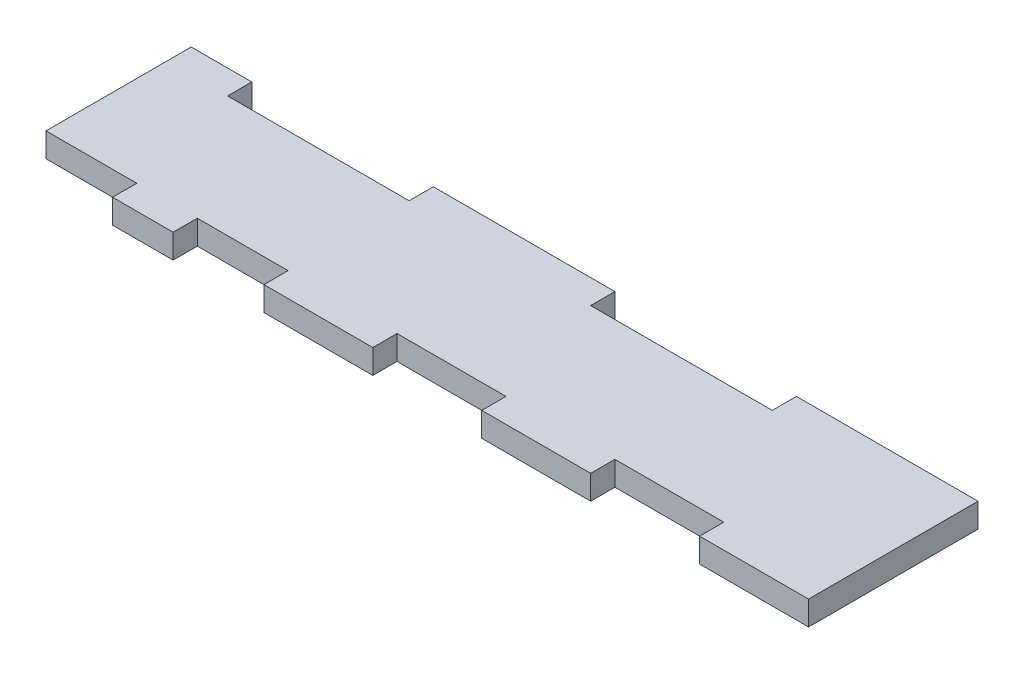
ISO-10303-21;
HEADER;
FILE_DESCRIPTION(('STEP AP214'),'2;1');
FILE_NAME('part.step','',(''),(''),'','','');
FILE_SCHEMA(('AUTOMOTIVE_DESIGN { 1 0 10303 214 1 1 1 1 }'));
ENDSEC;
DATA;
#1=APPLICATION_CONTEXT('core data for automotive mechanical design processes');
#2=APPLICATION_PROTOCOL_DEFINITION('international standard','automotive_design',2000,#1);
#3=PRODUCT_CONTEXT('',#1,'mechanical');
#4=PRODUCT('Part','Part','',(#3));
#5=PRODUCT_RELATED_PRODUCT_CATEGORY('part','',(#4));
#6=PRODUCT_DEFINITION_FORMATION('','',#4);
#7=PRODUCT_DEFINITION_CONTEXT('part definition',#1,'design');
#8=PRODUCT_DEFINITION('design','',#6,#7);
#9=PRODUCT_DEFINITION_SHAPE('','',#8);
#10=(LENGTH_UNIT() NAMED_UNIT(*) SI_UNIT(.MILLI.,.METRE.));
#11=(NAMED_UNIT(*) PLANE_ANGLE_UNIT() SI_UNIT($,.RADIAN.));
#12=(NAMED_UNIT(*) SI_UNIT($,.STERADIAN.) SOLID_ANGLE_UNIT());
#13=UNCERTAINTY_MEASURE_WITH_UNIT(LENGTH_MEASURE(1.E-05),#10,'distance_accuracy_value','');
#14=(GEOMETRIC_REPRESENTATION_CONTEXT(3) GLOBAL_UNCERTAINTY_ASSIGNED_CONTEXT((#13)) GLOBAL_UNIT_ASSIGNED_CONTEXT((#10,
#11,#12)) REPRESENTATION_CONTEXT('',''));
#15=CARTESIAN_POINT('',(0.,0.,0.));
#16=DIRECTION('',(0.,0.,1.));
#17=DIRECTION('',(1.,0.,0.));
#18=AXIS2_PLACEMENT_3D('',#15,#16,#17);
#19=CARTESIAN_POINT('',(65.,2.,-14.));
#20=DIRECTION('',(0.,0.,1.));
#21=DIRECTION('',(1.,0.,0.));
#22=AXIS2_PLACEMENT_3D('',#19,#20,#21);
#23=PLANE('',#22);
#24=DIRECTION('',(-1.,0.,0.));
#25=VECTOR('',#24,1.);
#26=CARTESIAN_POINT('',(65.,-2.,-14.));
#27=LINE('',#26,#25);
#28=CARTESIAN_POINT('',(65.,-2.,-14.));
#29=VERTEX_POINT('',#28);
#30=CARTESIAN_POINT('',(35.,-2.,-14.));
#31=VERTEX_POINT('',#30);
#32=EDGE_CURVE('E251',#29,#31,#27,.T.);
#33=ORIENTED_EDGE('',*,*,#32,.T.);
#34=DIRECTION('',(0.,-1.,0.));
#35=VECTOR('',#34,1.);
#36=CARTESIAN_POINT('',(35.,2.,-14.));
#37=LINE('',#36,#35);
#38=CARTESIAN_POINT('',(35.,2.,-14.));
#39=VERTEX_POINT('',#38);
#40=EDGE_CURVE('E50',#39,#31,#37,.T.);
#41=ORIENTED_EDGE('',*,*,#40,.F.);
#42=DIRECTION('',(-1.,0.,0.));
#43=VECTOR('',#42,1.);
#44=CARTESIAN_POINT('',(65.,2.,-14.));
#45=LINE('',#44,#43);
#46=CARTESIAN_POINT('',(65.,2.,-14.));
#47=VERTEX_POINT('',#46);
#48=EDGE_CURVE('E157',#47,#39,#45,.T.);
#49=ORIENTED_EDGE('',*,*,#48,.F.);
#50=DIRECTION('',(0.,-1.,0.));
#51=VECTOR('',#50,1.);
#52=CARTESIAN_POINT('',(65.,2.,-14.));
#53=LINE('',#52,#51);
#54=EDGE_CURVE('E11',#47,#29,#53,.T.);
#55=ORIENTED_EDGE('',*,*,#54,.T.);
#56=EDGE_LOOP('',(#33,#41,#49,#55));
#57=FACE_BOUND('',#56,.T.);
#58=ADVANCED_FACE('F42',(#57),#23,.F.);
#59=CARTESIAN_POINT('',(35.,2.,-10.));
#60=DIRECTION('',(1.,0.,0.));
#61=DIRECTION('',(0.,0.,-1.));
#62=AXIS2_PLACEMENT_3D('',#59,#60,#61);
#63=PLANE('',#62);
#64=DIRECTION('',(0.,0.,1.));
#65=VECTOR('',#64,1.);
#66=CARTESIAN_POINT('',(35.,-2.,-10.));
#67=LINE('',#66,#65);
#68=CARTESIAN_POINT('',(35.,-2.,-10.));
#69=VERTEX_POINT('',#68);
#70=EDGE_CURVE('E253',#31,#69,#67,.T.);
#71=ORIENTED_EDGE('',*,*,#70,.T.);
#72=DIRECTION('',(0.,-1.,0.));
#73=VECTOR('',#72,1.);
#74=CARTESIAN_POINT('',(35.,2.,-10.));
#75=LINE('',#74,#73);
#76=CARTESIAN_POINT('',(35.,2.,-10.));
#77=VERTEX_POINT('',#76);
#78=EDGE_CURVE('E361',#77,#69,#75,.T.);
#79=ORIENTED_EDGE('',*,*,#78,.F.);
#80=DIRECTION('',(0.,0.,1.));
#81=VECTOR('',#80,1.);
#82=CARTESIAN_POINT('',(35.,2.,-10.));
#83=LINE('',#82,#81);
#84=EDGE_CURVE('E369',#39,#77,#83,.T.);
#85=ORIENTED_EDGE('',*,*,#84,.F.);
#86=ORIENTED_EDGE('',*,*,#40,.T.);
#87=EDGE_LOOP('',(#71,#79,#85,#86));
#88=FACE_BOUND('',#87,.T.);
#89=ADVANCED_FACE('F367',(#88),#63,.F.);
#90=CARTESIAN_POINT('',(5.00000000000002,2.,-10.));
#91=DIRECTION('',(0.,0.,1.));
#92=DIRECTION('',(1.,0.,0.));
#93=AXIS2_PLACEMENT_3D('',#90,#91,#92);
#94=PLANE('',#93);
#95=DIRECTION('',(-1.,0.,0.));
#96=VECTOR('',#95,1.);
#97=CARTESIAN_POINT('',(5.00000000000002,-2.,-10.));
#98=LINE('',#97,#96);
#99=CARTESIAN_POINT('',(5.00000000000002,-2.,-10.));
#100=VERTEX_POINT('',#99);
#101=EDGE_CURVE('E255',#69,#100,#98,.T.);
#102=ORIENTED_EDGE('',*,*,#101,.T.);
#103=DIRECTION('',(0.,-1.,0.));
#104=VECTOR('',#103,1.);
#105=CARTESIAN_POINT('',(5.00000000000002,2.,-10.));
#106=LINE('',#105,#104);
#107=CARTESIAN_POINT('',(5.00000000000002,2.,-10.));
#108=VERTEX_POINT('',#107);
#109=EDGE_CURVE('E358',#108,#100,#106,.T.);
#110=ORIENTED_EDGE('',*,*,#109,.F.);
#111=DIRECTION('',(-1.,0.,0.));
#112=VECTOR('',#111,1.);
#113=CARTESIAN_POINT('',(5.00000000000002,2.,-10.));
#114=LINE('',#113,#112);
#115=EDGE_CURVE('E385',#77,#108,#114,.T.);
#116=ORIENTED_EDGE('',*,*,#115,.F.);
#117=ORIENTED_EDGE('',*,*,#78,.T.);
#118=EDGE_LOOP('',(#102,#110,#116,#117));
#119=FACE_BOUND('',#118,.T.);
#120=ADVANCED_FACE('F376',(#119),#94,.F.);
#121=CARTESIAN_POINT('',(5.00000000000002,2.,-10.));
#122=DIRECTION('',(-1.,0.,0.));
#123=DIRECTION('',(0.,0.,1.));
#124=AXIS2_PLACEMENT_3D('',#121,#122,#123);
#125=PLANE('',#124);
#126=DIRECTION('',(0.,0.,-1.));
#127=VECTOR('',#126,1.);
#128=CARTESIAN_POINT('',(5.00000000000002,-2.,-10.));
#129=LINE('',#128,#127);
#130=CARTESIAN_POINT('',(5.00000000000002,-2.,-14.));
#131=VERTEX_POINT('',#130);
#132=EDGE_CURVE('E257',#100,#131,#129,.T.);
#133=ORIENTED_EDGE('',*,*,#132,.T.);
#134=DIRECTION('',(0.,-1.,0.));
#135=VECTOR('',#134,1.);
#136=CARTESIAN_POINT('',(5.00000000000002,2.,-14.));
#137=LINE('',#136,#135);
#138=CARTESIAN_POINT('',(5.00000000000002,2.,-14.));
#139=VERTEX_POINT('',#138);
#140=EDGE_CURVE('E355',#139,#131,#137,.T.);
#141=ORIENTED_EDGE('',*,*,#140,.F.);
#142=DIRECTION('',(0.,0.,-1.));
#143=VECTOR('',#142,1.);
#144=CARTESIAN_POINT('',(5.00000000000002,2.,-10.));
#145=LINE('',#144,#143);
#146=EDGE_CURVE('E382',#108,#139,#145,.T.);
#147=ORIENTED_EDGE('',*,*,#146,.F.);
#148=ORIENTED_EDGE('',*,*,#109,.T.);
#149=EDGE_LOOP('',(#133,#141,#147,#148));
#150=FACE_BOUND('',#149,.T.);
#151=ADVANCED_FACE('F380',(#150),#125,.F.);
#152=CARTESIAN_POINT('',(5.00000000000002,2.,-14.));
#153=DIRECTION('',(0.,0.,1.));
#154=DIRECTION('',(1.,0.,0.));
#155=AXIS2_PLACEMENT_3D('',#152,#153,#154);
#156=PLANE('',#155);
#157=DIRECTION('',(-1.,0.,0.));
#158=VECTOR('',#157,1.);
#159=CARTESIAN_POINT('',(5.00000000000002,-2.,-14.));
#160=LINE('',#159,#158);
#161=CARTESIAN_POINT('',(-25.,-2.,-14.));
#162=VERTEX_POINT('',#161);
#163=EDGE_CURVE('E259',#131,#162,#160,.T.);
#164=ORIENTED_EDGE('',*,*,#163,.T.);
#165=DIRECTION('',(0.,-1.,0.));
#166=VECTOR('',#165,1.);
#167=CARTESIAN_POINT('',(-25.,2.,-14.));
#168=LINE('',#167,#166);
#169=CARTESIAN_POINT('',(-25.,2.,-14.));
#170=VERTEX_POINT('',#169);
#171=EDGE_CURVE('E352',#170,#162,#168,.T.);
#172=ORIENTED_EDGE('',*,*,#171,.F.);
#173=DIRECTION('',(-1.,0.,0.));
#174=VECTOR('',#173,1.);
#175=CARTESIAN_POINT('',(5.00000000000002,2.,-14.));
#176=LINE('',#175,#174);
#177=EDGE_CURVE('E384',#139,#170,#176,.T.);
#178=ORIENTED_EDGE('',*,*,#177,.F.);
#179=ORIENTED_EDGE('',*,*,#140,.T.);
#180=EDGE_LOOP('',(#164,#172,#178,#179));
#181=FACE_BOUND('',#180,.T.);
#182=ADVANCED_FACE('F447',(#181),#156,.F.);
#183=CARTESIAN_POINT('',(-25.,2.,-10.));
#184=DIRECTION('',(1.,0.,0.));
#185=DIRECTION('',(0.,0.,-1.));
#186=AXIS2_PLACEMENT_3D('',#183,#184,#185);
#187=PLANE('',#186);
#188=DIRECTION('',(0.,0.,1.));
#189=VECTOR('',#188,1.);
#190=CARTESIAN_POINT('',(-25.,-2.,-10.));
#191=LINE('',#190,#189);
#192=CARTESIAN_POINT('',(-25.,-2.,-10.));
#193=VERTEX_POINT('',#192);
#194=EDGE_CURVE('E261',#162,#193,#191,.T.);
#195=ORIENTED_EDGE('',*,*,#194,.T.);
#196=DIRECTION('',(0.,-1.,0.));
#197=VECTOR('',#196,1.);
#198=CARTESIAN_POINT('',(-25.,2.,-10.));
#199=LINE('',#198,#197);
#200=CARTESIAN_POINT('',(-25.,2.,-10.));
#201=VERTEX_POINT('',#200);
#202=EDGE_CURVE('E349',#201,#193,#199,.T.);
#203=ORIENTED_EDGE('',*,*,#202,.F.);
#204=DIRECTION('',(0.,0.,1.));
#205=VECTOR('',#204,1.);
#206=CARTESIAN_POINT('',(-25.,2.,-10.));
#207=LINE('',#206,#205);
#208=EDGE_CURVE('E387',#170,#201,#207,.T.);
#209=ORIENTED_EDGE('',*,*,#208,.F.);
#210=ORIENTED_EDGE('',*,*,#171,.T.);
#211=EDGE_LOOP('',(#195,#203,#209,#210));
#212=FACE_BOUND('',#211,.T.);
#213=ADVANCED_FACE('F450',(#212),#187,.F.);
#214=CARTESIAN_POINT('',(-55.,2.,-10.));
#215=DIRECTION('',(0.,0.,1.));
#216=DIRECTION('',(1.,0.,0.));
#217=AXIS2_PLACEMENT_3D('',#214,#215,#216);
#218=PLANE('',#217);
#219=DIRECTION('',(-1.,0.,0.));
#220=VECTOR('',#219,1.);
#221=CARTESIAN_POINT('',(-55.,-2.,-10.));
#222=LINE('',#221,#220);
#223=CARTESIAN_POINT('',(-55.,-2.,-10.));
#224=VERTEX_POINT('',#223);
#225=EDGE_CURVE('E263',#193,#224,#222,.T.);
#226=ORIENTED_EDGE('',*,*,#225,.T.);
#227=DIRECTION('',(0.,-1.,0.));
#228=VECTOR('',#227,1.);
#229=CARTESIAN_POINT('',(-55.,2.,-10.));
#230=LINE('',#229,#228);
#231=CARTESIAN_POINT('',(-55.,2.,-10.));
#232=VERTEX_POINT('',#231);
#233=EDGE_CURVE('E346',#232,#224,#230,.T.);
#234=ORIENTED_EDGE('',*,*,#233,.F.);
#235=DIRECTION('',(-1.,0.,0.));
#236=VECTOR('',#235,1.);
#237=CARTESIAN_POINT('',(-55.,2.,-10.));
#238=LINE('',#237,#236);
#239=EDGE_CURVE('E393',#201,#232,#238,.T.);
#240=ORIENTED_EDGE('',*,*,#239,.F.);
#241=ORIENTED_EDGE('',*,*,#202,.T.);
#242=EDGE_LOOP('',(#226,#234,#240,#241));
#243=FACE_BOUND('',#242,.T.);
#244=ADVANCED_FACE('F454',(#243),#218,.F.);
#245=CARTESIAN_POINT('',(-55.,2.,-10.));
#246=DIRECTION('',(-1.,0.,0.));
#247=DIRECTION('',(0.,0.,1.));
#248=AXIS2_PLACEMENT_3D('',#245,#246,#247);
#249=PLANE('',#248);
#250=DIRECTION('',(0.,0.,-1.));
#251=VECTOR('',#250,1.);
#252=CARTESIAN_POINT('',(-55.,-2.,-10.));
#253=LINE('',#252,#251);
#254=CARTESIAN_POINT('',(-55.,-2.,-14.));
#255=VERTEX_POINT('',#254);
#256=EDGE_CURVE('E265',#224,#255,#253,.T.);
#257=ORIENTED_EDGE('',*,*,#256,.T.);
#258=DIRECTION('',(0.,-1.,0.));
#259=VECTOR('',#258,1.);
#260=CARTESIAN_POINT('',(-55.,2.,-14.));
#261=LINE('',#260,#259);
#262=CARTESIAN_POINT('',(-55.,2.,-14.));
#263=VERTEX_POINT('',#262);
#264=EDGE_CURVE('E343',#263,#255,#261,.T.);
#265=ORIENTED_EDGE('',*,*,#264,.F.);
#266=DIRECTION('',(0.,0.,-1.));
#267=VECTOR('',#266,1.);
#268=CARTESIAN_POINT('',(-55.,2.,-10.));
#269=LINE('',#268,#267);
#270=EDGE_CURVE('E395',#232,#263,#269,.T.);
#271=ORIENTED_EDGE('',*,*,#270,.F.);
#272=ORIENTED_EDGE('',*,*,#233,.T.);
#273=EDGE_LOOP('',(#257,#265,#271,#272));
#274=FACE_BOUND('',#273,.T.);
#275=ADVANCED_FACE('F458',(#274),#249,.F.);
#276=CARTESIAN_POINT('',(-65.,2.,-14.));
#277=DIRECTION('',(0.,0.,1.));
#278=DIRECTION('',(1.,0.,0.));
#279=AXIS2_PLACEMENT_3D('',#276,#277,#278);
#280=PLANE('',#279);
#281=DIRECTION('',(-1.,0.,0.));
#282=VECTOR('',#281,1.);
#283=CARTESIAN_POINT('',(-65.,-2.,-14.));
#284=LINE('',#283,#282);
#285=CARTESIAN_POINT('',(-65.,-2.,-14.));
#286=VERTEX_POINT('',#285);
#287=EDGE_CURVE('E267',#255,#286,#284,.T.);
#288=ORIENTED_EDGE('',*,*,#287,.T.);
#289=DIRECTION('',(0.,-1.,0.));
#290=VECTOR('',#289,1.);
#291=CARTESIAN_POINT('',(-65.,2.,-14.));
#292=LINE('',#291,#290);
#293=CARTESIAN_POINT('',(-65.,2.,-14.));
#294=VERTEX_POINT('',#293);
#295=EDGE_CURVE('E340',#294,#286,#292,.T.);
#296=ORIENTED_EDGE('',*,*,#295,.F.);
#297=DIRECTION('',(-1.,0.,0.));
#298=VECTOR('',#297,1.);
#299=CARTESIAN_POINT('',(-65.,2.,-14.));
#300=LINE('',#299,#298);
#301=EDGE_CURVE('E397',#263,#294,#300,.T.);
#302=ORIENTED_EDGE('',*,*,#301,.F.);
#303=ORIENTED_EDGE('',*,*,#264,.T.);
#304=EDGE_LOOP('',(#288,#296,#302,#303));
#305=FACE_BOUND('',#304,.T.);
#306=ADVANCED_FACE('F462',(#305),#280,.F.);
#307=CARTESIAN_POINT('',(-65.,2.,10.));
#308=DIRECTION('',(1.,0.,0.));
#309=DIRECTION('',(0.,0.,-1.));
#310=AXIS2_PLACEMENT_3D('',#307,#308,#309);
#311=PLANE('',#310);
#312=DIRECTION('',(0.,0.,1.));
#313=VECTOR('',#312,1.);
#314=CARTESIAN_POINT('',(-65.,-2.,10.));
#315=LINE('',#314,#313);
#316=CARTESIAN_POINT('',(-65.,-2.,10.));
#317=VERTEX_POINT('',#316);
#318=EDGE_CURVE('E270',#286,#317,#315,.T.);
#319=ORIENTED_EDGE('',*,*,#318,.T.);
#320=DIRECTION('',(0.,-1.,0.));
#321=VECTOR('',#320,1.);
#322=CARTESIAN_POINT('',(-65.,2.,10.));
#323=LINE('',#322,#321);
#324=CARTESIAN_POINT('',(-65.,2.,10.));
#325=VERTEX_POINT('',#324);
#326=EDGE_CURVE('E337',#325,#317,#323,.T.);
#327=ORIENTED_EDGE('',*,*,#326,.F.);
#328=DIRECTION('',(0.,0.,1.));
#329=VECTOR('',#328,1.);
#330=CARTESIAN_POINT('',(-65.,2.,-10.));
#331=LINE('',#330,#329);
#332=EDGE_CURVE('E399',#294,#325,#331,.T.);
#333=ORIENTED_EDGE('',*,*,#332,.F.);
#334=ORIENTED_EDGE('',*,*,#295,.T.);
#335=EDGE_LOOP('',(#319,#327,#333,#334));
#336=FACE_BOUND('',#335,.T.);
#337=ADVANCED_FACE('F466',(#336),#311,.F.);
#338=CARTESIAN_POINT('',(-65.,2.,10.));
#339=DIRECTION('',(0.,0.,-1.));
#340=DIRECTION('',(-1.,0.,0.));
#341=AXIS2_PLACEMENT_3D('',#338,#339,#340);
#342=PLANE('',#341);
#343=DIRECTION('',(1.,0.,0.));
#344=VECTOR('',#343,1.);
#345=CARTESIAN_POINT('',(-65.,-2.,10.));
#346=LINE('',#345,#344);
#347=CARTESIAN_POINT('',(-50.,-2.,10.));
#348=VERTEX_POINT('',#347);
#349=EDGE_CURVE('E272',#317,#348,#346,.T.);
#350=ORIENTED_EDGE('',*,*,#349,.T.);
#351=DIRECTION('',(0.,-1.,0.));
#352=VECTOR('',#351,1.);
#353=CARTESIAN_POINT('',(-50.,2.,10.));
#354=LINE('',#353,#352);
#355=CARTESIAN_POINT('',(-50.,2.,10.));
#356=VERTEX_POINT('',#355);
#357=EDGE_CURVE('E334',#356,#348,#354,.T.);
#358=ORIENTED_EDGE('',*,*,#357,.F.);
#359=DIRECTION('',(1.,0.,0.));
#360=VECTOR('',#359,1.);
#361=CARTESIAN_POINT('',(-65.,2.,10.));
#362=LINE('',#361,#360);
#363=EDGE_CURVE('E401',#325,#356,#362,.T.);
#364=ORIENTED_EDGE('',*,*,#363,.F.);
#365=ORIENTED_EDGE('',*,*,#326,.T.);
#366=EDGE_LOOP('',(#350,#358,#364,#365));
#367=FACE_BOUND('',#366,.T.);
#368=ADVANCED_FACE('F470',(#367),#342,.F.);
#369=CARTESIAN_POINT('',(-50.,2.,14.));
#370=DIRECTION('',(1.,0.,0.));
#371=DIRECTION('',(0.,0.,-1.));
#372=AXIS2_PLACEMENT_3D('',#369,#370,#371);
#373=PLANE('',#372);
#374=DIRECTION('',(0.,0.,1.));
#375=VECTOR('',#374,1.);
#376=CARTESIAN_POINT('',(-50.,-2.,14.));
#377=LINE('',#376,#375);
#378=CARTESIAN_POINT('',(-50.,-2.,14.));
#379=VERTEX_POINT('',#378);
#380=EDGE_CURVE('E274',#348,#379,#377,.T.);
#381=ORIENTED_EDGE('',*,*,#380,.T.);
#382=DIRECTION('',(0.,-1.,0.));
#383=VECTOR('',#382,1.);
#384=CARTESIAN_POINT('',(-50.,2.,14.));
#385=LINE('',#384,#383);
#386=CARTESIAN_POINT('',(-50.,2.,14.));
#387=VERTEX_POINT('',#386);
#388=EDGE_CURVE('E331',#387,#379,#385,.T.);
#389=ORIENTED_EDGE('',*,*,#388,.F.);
#390=DIRECTION('',(0.,0.,1.));
#391=VECTOR('',#390,1.);
#392=CARTESIAN_POINT('',(-50.,2.,14.));
#393=LINE('',#392,#391);
#394=EDGE_CURVE('E403',#356,#387,#393,.T.);
#395=ORIENTED_EDGE('',*,*,#394,.F.);
#396=ORIENTED_EDGE('',*,*,#357,.T.);
#397=EDGE_LOOP('',(#381,#389,#395,#396));
#398=FACE_BOUND('',#397,.T.);
#399=ADVANCED_FACE('F474',(#398),#373,.F.);
#400=CARTESIAN_POINT('',(-50.,2.,14.));
#401=DIRECTION('',(0.,0.,-1.));
#402=DIRECTION('',(-1.,0.,0.));
#403=AXIS2_PLACEMENT_3D('',#400,#401,#402);
#404=PLANE('',#403);
#405=DIRECTION('',(1.,0.,0.));
#406=VECTOR('',#405,1.);
#407=CARTESIAN_POINT('',(-50.,-2.,14.));
#408=LINE('',#407,#406);
#409=CARTESIAN_POINT('',(-40.,-2.,14.));
#410=VERTEX_POINT('',#409);
#411=EDGE_CURVE('E276',#379,#410,#408,.T.);
#412=ORIENTED_EDGE('',*,*,#411,.T.);
#413=DIRECTION('',(0.,-1.,0.));
#414=VECTOR('',#413,1.);
#415=CARTESIAN_POINT('',(-40.,2.,14.));
#416=LINE('',#415,#414);
#417=CARTESIAN_POINT('',(-40.,2.,14.));
#418=VERTEX_POINT('',#417);
#419=EDGE_CURVE('E328',#418,#410,#416,.T.);
#420=ORIENTED_EDGE('',*,*,#419,.F.);
#421=DIRECTION('',(1.,0.,0.));
#422=VECTOR('',#421,1.);
#423=CARTESIAN_POINT('',(-50.,2.,14.));
#424=LINE('',#423,#422);
#425=EDGE_CURVE('E405',#387,#418,#424,.T.);
#426=ORIENTED_EDGE('',*,*,#425,.F.);
#427=ORIENTED_EDGE('',*,*,#388,.T.);
#428=EDGE_LOOP('',(#412,#420,#426,#427));
#429=FACE_BOUND('',#428,.T.);
#430=ADVANCED_FACE('F478',(#429),#404,.F.);
#431=CARTESIAN_POINT('',(-40.,2.,14.));
#432=DIRECTION('',(-1.,0.,0.));
#433=DIRECTION('',(0.,0.,1.));
#434=AXIS2_PLACEMENT_3D('',#431,#432,#433);
#435=PLANE('',#434);
#436=DIRECTION('',(0.,0.,-1.));
#437=VECTOR('',#436,1.);
#438=CARTESIAN_POINT('',(-40.,-2.,14.));
#439=LINE('',#438,#437);
#440=CARTESIAN_POINT('',(-40.,-2.,10.));
#441=VERTEX_POINT('',#440);
#442=EDGE_CURVE('E278',#410,#441,#439,.T.);
#443=ORIENTED_EDGE('',*,*,#442,.T.);
#444=DIRECTION('',(0.,-1.,0.));
#445=VECTOR('',#444,1.);
#446=CARTESIAN_POINT('',(-40.,2.,10.));
#447=LINE('',#446,#445);
#448=CARTESIAN_POINT('',(-40.,2.,10.));
#449=VERTEX_POINT('',#448);
#450=EDGE_CURVE('E325',#449,#441,#447,.T.);
#451=ORIENTED_EDGE('',*,*,#450,.F.);
#452=DIRECTION('',(0.,0.,-1.));
#453=VECTOR('',#452,1.);
#454=CARTESIAN_POINT('',(-40.,2.,14.));
#455=LINE('',#454,#453);
#456=EDGE_CURVE('E407',#418,#449,#455,.T.);
#457=ORIENTED_EDGE('',*,*,#456,.F.);
#458=ORIENTED_EDGE('',*,*,#419,.T.);
#459=EDGE_LOOP('',(#443,#451,#457,#458));
#460=FACE_BOUND('',#459,.T.);
#461=ADVANCED_FACE('F482',(#460),#435,.F.);
#462=CARTESIAN_POINT('',(-40.,2.,10.));
#463=DIRECTION('',(0.,0.,-1.));
#464=DIRECTION('',(-1.,0.,0.));
#465=AXIS2_PLACEMENT_3D('',#462,#463,#464);
#466=PLANE('',#465);
#467=DIRECTION('',(1.,0.,0.));
#468=VECTOR('',#467,1.);
#469=CARTESIAN_POINT('',(-40.,-2.,10.));
#470=LINE('',#469,#468);
#471=CARTESIAN_POINT('',(-25.,-2.,10.));
#472=VERTEX_POINT('',#471);
#473=EDGE_CURVE('E280',#441,#472,#470,.T.);
#474=ORIENTED_EDGE('',*,*,#473,.T.);
#475=DIRECTION('',(0.,-1.,0.));
#476=VECTOR('',#475,1.);
#477=CARTESIAN_POINT('',(-25.,2.,10.));
#478=LINE('',#477,#476);
#479=CARTESIAN_POINT('',(-25.,2.,10.));
#480=VERTEX_POINT('',#479);
#481=EDGE_CURVE('E322',#480,#472,#478,.T.);
#482=ORIENTED_EDGE('',*,*,#481,.F.);
#483=DIRECTION('',(1.,0.,0.));
#484=VECTOR('',#483,1.);
#485=CARTESIAN_POINT('',(-40.,2.,10.));
#486=LINE('',#485,#484);
#487=EDGE_CURVE('E409',#449,#480,#486,.T.);
#488=ORIENTED_EDGE('',*,*,#487,.F.);
#489=ORIENTED_EDGE('',*,*,#450,.T.);
#490=EDGE_LOOP('',(#474,#482,#488,#489));
#491=FACE_BOUND('',#490,.T.);
#492=ADVANCED_FACE('F486',(#491),#466,.F.);
#493=CARTESIAN_POINT('',(-25.,2.,10.));
#494=DIRECTION('',(1.,0.,0.));
#495=DIRECTION('',(0.,0.,-1.));
#496=AXIS2_PLACEMENT_3D('',#493,#494,#495);
#497=PLANE('',#496);
#498=DIRECTION('',(0.,0.,1.));
#499=VECTOR('',#498,1.);
#500=CARTESIAN_POINT('',(-25.,-2.,10.));
#501=LINE('',#500,#499);
#502=CARTESIAN_POINT('',(-25.,-2.,14.0000000000006));
#503=VERTEX_POINT('',#502);
#504=EDGE_CURVE('E282',#472,#503,#501,.T.);
#505=ORIENTED_EDGE('',*,*,#504,.T.);
#506=DIRECTION('',(0.,-1.,0.));
#507=VECTOR('',#506,1.);
#508=CARTESIAN_POINT('',(-25.,2.,14.0000000000006));
#509=LINE('',#508,#507);
#510=CARTESIAN_POINT('',(-25.,2.,14.0000000000006));
#511=VERTEX_POINT('',#510);
#512=EDGE_CURVE('E319',#511,#503,#509,.T.);
#513=ORIENTED_EDGE('',*,*,#512,.F.);
#514=DIRECTION('',(0.,0.,1.));
#515=VECTOR('',#514,1.);
#516=CARTESIAN_POINT('',(-25.,2.,10.));
#517=LINE('',#516,#515);
#518=EDGE_CURVE('E411',#480,#511,#517,.T.);
#519=ORIENTED_EDGE('',*,*,#518,.F.);
#520=ORIENTED_EDGE('',*,*,#481,.T.);
#521=EDGE_LOOP('',(#505,#513,#519,#520));
#522=FACE_BOUND('',#521,.T.);
#523=ADVANCED_FACE('F490',(#522),#497,.F.);
#524=CARTESIAN_POINT('',(-6.99999999999999,2.,14.0000000000005));
#525=DIRECTION('',(0.,0.,-1.));
#526=DIRECTION('',(-1.,0.,0.));
#527=AXIS2_PLACEMENT_3D('',#524,#525,#526);
#528=PLANE('',#527);
#529=DIRECTION('',(1.,0.,0.));
#530=VECTOR('',#529,1.);
#531=CARTESIAN_POINT('',(-6.99999999999999,-2.,14.0000000000005));
#532=LINE('',#531,#530);
#533=CARTESIAN_POINT('',(-6.99999999999999,-2.,14.0000000000005));
#534=VERTEX_POINT('',#533);
#535=EDGE_CURVE('E284',#503,#534,#532,.T.);
#536=ORIENTED_EDGE('',*,*,#535,.T.);
#537=DIRECTION('',(0.,-1.,0.));
#538=VECTOR('',#537,1.);
#539=CARTESIAN_POINT('',(-6.99999999999999,2.,14.0000000000005));
#540=LINE('',#539,#538);
#541=CARTESIAN_POINT('',(-6.99999999999999,2.,14.0000000000005));
#542=VERTEX_POINT('',#541);
#543=EDGE_CURVE('E316',#542,#534,#540,.T.);
#544=ORIENTED_EDGE('',*,*,#543,.F.);
#545=DIRECTION('',(1.,0.,0.));
#546=VECTOR('',#545,1.);
#547=CARTESIAN_POINT('',(-6.99999999999999,2.,14.0000000000005));
#548=LINE('',#547,#546);
#549=EDGE_CURVE('E413',#511,#542,#548,.T.);
#550=ORIENTED_EDGE('',*,*,#549,.F.);
#551=ORIENTED_EDGE('',*,*,#512,.T.);
#552=EDGE_LOOP('',(#536,#544,#550,#551));
#553=FACE_BOUND('',#552,.T.);
#554=ADVANCED_FACE('F494',(#553),#528,.F.);
#555=CARTESIAN_POINT('',(-6.99999999999998,2.,10.0000000000005));
#556=DIRECTION('',(-1.,0.,0.));
#557=DIRECTION('',(0.,0.,1.));
#558=AXIS2_PLACEMENT_3D('',#555,#556,#557);
#559=PLANE('',#558);
#560=DIRECTION('',(0.,0.,-1.));
#561=VECTOR('',#560,1.);
#562=CARTESIAN_POINT('',(-6.99999999999998,-2.,10.0000000000005));
#563=LINE('',#562,#561);
#564=CARTESIAN_POINT('',(-6.99999999999998,-2.,10.0000000000005));
#565=VERTEX_POINT('',#564);
#566=EDGE_CURVE('E286',#534,#565,#563,.T.);
#567=ORIENTED_EDGE('',*,*,#566,.T.);
#568=DIRECTION('',(0.,-1.,0.));
#569=VECTOR('',#568,1.);
#570=CARTESIAN_POINT('',(-6.99999999999998,2.,10.0000000000005));
#571=LINE('',#570,#569);
#572=CARTESIAN_POINT('',(-6.99999999999998,2.,10.0000000000005));
#573=VERTEX_POINT('',#572);
#574=EDGE_CURVE('E313',#573,#565,#571,.T.);
#575=ORIENTED_EDGE('',*,*,#574,.F.);
#576=DIRECTION('',(0.,0.,-1.));
#577=VECTOR('',#576,1.);
#578=CARTESIAN_POINT('',(-6.99999999999998,2.,10.0000000000005));
#579=LINE('',#578,#577);
#580=EDGE_CURVE('E415',#542,#573,#579,.T.);
#581=ORIENTED_EDGE('',*,*,#580,.F.);
#582=ORIENTED_EDGE('',*,*,#543,.T.);
#583=EDGE_LOOP('',(#567,#575,#581,#582));
#584=FACE_BOUND('',#583,.T.);
#585=ADVANCED_FACE('F498',(#584),#559,.F.);
#586=CARTESIAN_POINT('',(-6.99999999999998,2.,10.0000000000005));
#587=DIRECTION('',(0.,0.,-1.));
#588=DIRECTION('',(-1.,0.,0.));
#589=AXIS2_PLACEMENT_3D('',#586,#587,#588);
#590=PLANE('',#589);
#591=DIRECTION('',(1.,0.,0.));
#592=VECTOR('',#591,1.);
#593=CARTESIAN_POINT('',(-6.99999999999998,-2.,10.0000000000005));
#594=LINE('',#593,#592);
#595=CARTESIAN_POINT('',(11.,-2.,9.99999999999975));
#596=VERTEX_POINT('',#595);
#597=EDGE_CURVE('E288',#565,#596,#594,.T.);
#598=ORIENTED_EDGE('',*,*,#597,.T.);
#599=DIRECTION('',(0.,-1.,0.));
#600=VECTOR('',#599,1.);
#601=CARTESIAN_POINT('',(11.,2.,9.99999999999975));
#602=LINE('',#601,#600);
#603=CARTESIAN_POINT('',(11.,2.,9.99999999999975));
#604=VERTEX_POINT('',#603);
#605=EDGE_CURVE('E310',#604,#596,#602,.T.);
#606=ORIENTED_EDGE('',*,*,#605,.F.);
#607=DIRECTION('',(1.,0.,0.));
#608=VECTOR('',#607,1.);
#609=CARTESIAN_POINT('',(-6.99999999999998,2.,10.0000000000005));
#610=LINE('',#609,#608);
#611=EDGE_CURVE('E417',#573,#604,#610,.T.);
#612=ORIENTED_EDGE('',*,*,#611,.F.);
#613=ORIENTED_EDGE('',*,*,#574,.T.);
#614=EDGE_LOOP('',(#598,#606,#612,#613));
#615=FACE_BOUND('',#614,.T.);
#616=ADVANCED_FACE('F502',(#615),#590,.F.);
#617=CARTESIAN_POINT('',(11.,2.,9.99999999999975));
#618=DIRECTION('',(1.,0.,0.));
#619=DIRECTION('',(0.,0.,-1.));
#620=AXIS2_PLACEMENT_3D('',#617,#618,#619);
#621=PLANE('',#620);
#622=DIRECTION('',(0.,0.,1.));
#623=VECTOR('',#622,1.);
#624=CARTESIAN_POINT('',(11.,-2.,9.99999999999975));
#625=LINE('',#624,#623);
#626=CARTESIAN_POINT('',(11.,-2.,14.0000000000004));
#627=VERTEX_POINT('',#626);
#628=EDGE_CURVE('E290',#596,#627,#625,.T.);
#629=ORIENTED_EDGE('',*,*,#628,.T.);
#630=DIRECTION('',(0.,-1.,0.));
#631=VECTOR('',#630,1.);
#632=CARTESIAN_POINT('',(11.,2.,14.0000000000004));
#633=LINE('',#632,#631);
#634=CARTESIAN_POINT('',(11.,2.,14.0000000000004));
#635=VERTEX_POINT('',#634);
#636=EDGE_CURVE('E307',#635,#627,#633,.T.);
#637=ORIENTED_EDGE('',*,*,#636,.F.);
#638=DIRECTION('',(0.,0.,1.));
#639=VECTOR('',#638,1.);
#640=CARTESIAN_POINT('',(11.,2.,9.99999999999975));
#641=LINE('',#640,#639);
#642=EDGE_CURVE('E419',#604,#635,#641,.T.);
#643=ORIENTED_EDGE('',*,*,#642,.F.);
#644=ORIENTED_EDGE('',*,*,#605,.T.);
#645=EDGE_LOOP('',(#629,#637,#643,#644));
#646=FACE_BOUND('',#645,.T.);
#647=ADVANCED_FACE('F506',(#646),#621,.F.);
#648=CARTESIAN_POINT('',(29.,2.,14.0000000000003));
#649=DIRECTION('',(0.,0.,-1.));
#650=DIRECTION('',(-1.,0.,0.));
#651=AXIS2_PLACEMENT_3D('',#648,#649,#650);
#652=PLANE('',#651);
#653=DIRECTION('',(1.,0.,0.));
#654=VECTOR('',#653,1.);
#655=CARTESIAN_POINT('',(29.,-2.,14.0000000000003));
#656=LINE('',#655,#654);
#657=CARTESIAN_POINT('',(29.,-2.,14.0000000000003));
#658=VERTEX_POINT('',#657);
#659=EDGE_CURVE('E292',#627,#658,#656,.T.);
#660=ORIENTED_EDGE('',*,*,#659,.T.);
#661=DIRECTION('',(0.,-1.,0.));
#662=VECTOR('',#661,1.);
#663=CARTESIAN_POINT('',(29.,2.,14.0000000000003));
#664=LINE('',#663,#662);
#665=CARTESIAN_POINT('',(29.,2.,14.0000000000003));
#666=VERTEX_POINT('',#665);
#667=EDGE_CURVE('E304',#666,#658,#664,.T.);
#668=ORIENTED_EDGE('',*,*,#667,.F.);
#669=DIRECTION('',(1.,0.,0.));
#670=VECTOR('',#669,1.);
#671=CARTESIAN_POINT('',(29.,2.,14.0000000000003));
#672=LINE('',#671,#670);
#673=EDGE_CURVE('E421',#635,#666,#672,.T.);
#674=ORIENTED_EDGE('',*,*,#673,.F.);
#675=ORIENTED_EDGE('',*,*,#636,.T.);
#676=EDGE_LOOP('',(#660,#668,#674,#675));
#677=FACE_BOUND('',#676,.T.);
#678=ADVANCED_FACE('F427',(#677),#652,.F.);
#679=CARTESIAN_POINT('',(29.,2.,10.0000000000003));
#680=DIRECTION('',(-1.,0.,0.));
#681=DIRECTION('',(0.,0.,1.));
#682=AXIS2_PLACEMENT_3D('',#679,#680,#681);
#683=PLANE('',#682);
#684=DIRECTION('',(0.,0.,-1.));
#685=VECTOR('',#684,1.);
#686=CARTESIAN_POINT('',(29.,-2.,10.0000000000003));
#687=LINE('',#686,#685);
#688=CARTESIAN_POINT('',(29.,-2.,10.0000000000003));
#689=VERTEX_POINT('',#688);
#690=EDGE_CURVE('E294',#658,#689,#687,.T.);
#691=ORIENTED_EDGE('',*,*,#690,.T.);
#692=DIRECTION('',(0.,-1.,0.));
#693=VECTOR('',#692,1.);
#694=CARTESIAN_POINT('',(29.,2.,10.0000000000003));
#695=LINE('',#694,#693);
#696=CARTESIAN_POINT('',(29.,2.,10.0000000000003));
#697=VERTEX_POINT('',#696);
#698=EDGE_CURVE('E240',#697,#689,#695,.T.);
#699=ORIENTED_EDGE('',*,*,#698,.F.);
#700=DIRECTION('',(0.,0.,-1.));
#701=VECTOR('',#700,1.);
#702=CARTESIAN_POINT('',(29.,2.,10.0000000000003));
#703=LINE('',#702,#701);
#704=EDGE_CURVE('E231',#666,#697,#703,.T.);
#705=ORIENTED_EDGE('',*,*,#704,.F.);
#706=ORIENTED_EDGE('',*,*,#667,.T.);
#707=EDGE_LOOP('',(#691,#699,#705,#706));
#708=FACE_BOUND('',#707,.T.);
#709=ADVANCED_FACE('F431',(#708),#683,.F.);
#710=CARTESIAN_POINT('',(29.,2.,10.0000000000003));
#711=DIRECTION('',(0.,0.,-1.));
#712=DIRECTION('',(-1.,0.,0.));
#713=AXIS2_PLACEMENT_3D('',#710,#711,#712);
#714=PLANE('',#713);
#715=DIRECTION('',(1.,0.,0.));
#716=VECTOR('',#715,1.);
#717=CARTESIAN_POINT('',(29.,-2.,10.0000000000003));
#718=LINE('',#717,#716);
#719=CARTESIAN_POINT('',(47.,-2.,9.9999999999995));
#720=VERTEX_POINT('',#719);
#721=EDGE_CURVE('E239',#689,#720,#718,.T.);
#722=ORIENTED_EDGE('',*,*,#721,.T.);
#723=DIRECTION('',(0.,-1.,0.));
#724=VECTOR('',#723,1.);
#725=CARTESIAN_POINT('',(47.,2.,9.9999999999995));
#726=LINE('',#725,#724);
#727=CARTESIAN_POINT('',(47.,2.,9.9999999999995));
#728=VERTEX_POINT('',#727);
#729=EDGE_CURVE('E236',#728,#720,#726,.T.);
#730=ORIENTED_EDGE('',*,*,#729,.F.);
#731=DIRECTION('',(1.,0.,0.));
#732=VECTOR('',#731,1.);
#733=CARTESIAN_POINT('',(29.,2.,10.0000000000003));
#734=LINE('',#733,#732);
#735=EDGE_CURVE('E225',#697,#728,#734,.T.);
#736=ORIENTED_EDGE('',*,*,#735,.F.);
#737=ORIENTED_EDGE('',*,*,#698,.T.);
#738=EDGE_LOOP('',(#722,#730,#736,#737));
#739=FACE_BOUND('',#738,.T.);
#740=ADVANCED_FACE('F237',(#739),#714,.F.);
#741=CARTESIAN_POINT('',(47.,2.,9.9999999999995));
#742=DIRECTION('',(1.,0.,0.));
#743=DIRECTION('',(0.,0.,-1.));
#744=AXIS2_PLACEMENT_3D('',#741,#742,#743);
#745=PLANE('',#744);
#746=DIRECTION('',(0.,0.,1.));
#747=VECTOR('',#746,1.);
#748=CARTESIAN_POINT('',(47.,-2.,9.9999999999995));
#749=LINE('',#748,#747);
#750=CARTESIAN_POINT('',(47.,-2.,14.0000000000001));
#751=VERTEX_POINT('',#750);
#752=EDGE_CURVE('E142',#720,#751,#749,.T.);
#753=ORIENTED_EDGE('',*,*,#752,.T.);
#754=DIRECTION('',(0.,-1.,0.));
#755=VECTOR('',#754,1.);
#756=CARTESIAN_POINT('',(47.,2.,14.0000000000001));
#757=LINE('',#756,#755);
#758=CARTESIAN_POINT('',(47.,2.,14.0000000000001));
#759=VERTEX_POINT('',#758);
#760=EDGE_CURVE('E241',#759,#751,#757,.T.);
#761=ORIENTED_EDGE('',*,*,#760,.F.);
#762=DIRECTION('',(0.,0.,1.));
#763=VECTOR('',#762,1.);
#764=CARTESIAN_POINT('',(47.,2.,9.9999999999995));
#765=LINE('',#764,#763);
#766=EDGE_CURVE('E229',#728,#759,#765,.T.);
#767=ORIENTED_EDGE('',*,*,#766,.F.);
#768=ORIENTED_EDGE('',*,*,#729,.T.);
#769=EDGE_LOOP('',(#753,#761,#767,#768));
#770=FACE_BOUND('',#769,.T.);
#771=ADVANCED_FACE('F243',(#770),#745,.F.);
#772=CARTESIAN_POINT('',(65.,2.,14.));
#773=DIRECTION('',(0.,0.,-1.));
#774=DIRECTION('',(-1.,0.,0.));
#775=AXIS2_PLACEMENT_3D('',#772,#773,#774);
#776=PLANE('',#775);
#777=DIRECTION('',(1.,0.,0.));
#778=VECTOR('',#777,1.);
#779=CARTESIAN_POINT('',(65.,-2.,14.));
#780=LINE('',#779,#778);
#781=CARTESIAN_POINT('',(65.,-2.,14.));
#782=VERTEX_POINT('',#781);
#783=EDGE_CURVE('E298',#751,#782,#780,.T.);
#784=ORIENTED_EDGE('',*,*,#783,.T.);
#785=DIRECTION('',(0.,-1.,0.));
#786=VECTOR('',#785,1.);
#787=CARTESIAN_POINT('',(65.,2.,14.));
#788=LINE('',#787,#786);
#789=CARTESIAN_POINT('',(65.,2.,14.));
#790=VERTEX_POINT('',#789);
#791=EDGE_CURVE('E247',#790,#782,#788,.T.);
#792=ORIENTED_EDGE('',*,*,#791,.F.);
#793=DIRECTION('',(1.,0.,0.));
#794=VECTOR('',#793,1.);
#795=CARTESIAN_POINT('',(65.,2.,14.));
#796=LINE('',#795,#794);
#797=EDGE_CURVE('E245',#759,#790,#796,.T.);
#798=ORIENTED_EDGE('',*,*,#797,.F.);
#799=ORIENTED_EDGE('',*,*,#760,.T.);
#800=EDGE_LOOP('',(#784,#792,#798,#799));
#801=FACE_BOUND('',#800,.T.);
#802=ADVANCED_FACE('F434',(#801),#776,.F.);
#803=CARTESIAN_POINT('',(65.,2.,10.));
#804=DIRECTION('',(-1.,0.,0.));
#805=DIRECTION('',(0.,0.,1.));
#806=AXIS2_PLACEMENT_3D('',#803,#804,#805);
#807=PLANE('',#806);
#808=DIRECTION('',(0.,0.,-1.));
#809=VECTOR('',#808,1.);
#810=CARTESIAN_POINT('',(65.,-2.,10.));
#811=LINE('',#810,#809);
#812=EDGE_CURVE('E149',#782,#29,#811,.T.);
#813=ORIENTED_EDGE('',*,*,#812,.T.);
#814=ORIENTED_EDGE('',*,*,#54,.F.);
#815=DIRECTION('',(0.,0.,-1.));
#816=VECTOR('',#815,1.);
#817=CARTESIAN_POINT('',(65.,2.,-10.));
#818=LINE('',#817,#816);
#819=EDGE_CURVE('E58',#790,#47,#818,.T.);
#820=ORIENTED_EDGE('',*,*,#819,.F.);
#821=ORIENTED_EDGE('',*,*,#791,.T.);
#822=EDGE_LOOP('',(#813,#814,#820,#821));
#823=FACE_BOUND('',#822,.T.);
#824=ADVANCED_FACE('F435',(#823),#807,.F.);
#825=CARTESIAN_POINT('',(0.,2.,0.));
#826=DIRECTION('',(0.,1.,0.));
#827=DIRECTION('',(0.,0.,1.));
#828=AXIS2_PLACEMENT_3D('',#825,#826,#827);
#829=PLANE('',#828);
#830=ORIENTED_EDGE('',*,*,#819,.T.);
#831=ORIENTED_EDGE('',*,*,#48,.T.);
#832=ORIENTED_EDGE('',*,*,#84,.T.);
#833=ORIENTED_EDGE('',*,*,#115,.T.);
#834=ORIENTED_EDGE('',*,*,#146,.T.);
#835=ORIENTED_EDGE('',*,*,#177,.T.);
#836=ORIENTED_EDGE('',*,*,#208,.T.);
#837=ORIENTED_EDGE('',*,*,#239,.T.);
#838=ORIENTED_EDGE('',*,*,#270,.T.);
#839=ORIENTED_EDGE('',*,*,#301,.T.);
#840=ORIENTED_EDGE('',*,*,#332,.T.);
#841=ORIENTED_EDGE('',*,*,#363,.T.);
#842=ORIENTED_EDGE('',*,*,#394,.T.);
#843=ORIENTED_EDGE('',*,*,#425,.T.);
#844=ORIENTED_EDGE('',*,*,#456,.T.);
#845=ORIENTED_EDGE('',*,*,#487,.T.);
#846=ORIENTED_EDGE('',*,*,#518,.T.);
#847=ORIENTED_EDGE('',*,*,#549,.T.);
#848=ORIENTED_EDGE('',*,*,#580,.T.);
#849=ORIENTED_EDGE('',*,*,#611,.T.);
#850=ORIENTED_EDGE('',*,*,#642,.T.);
#851=ORIENTED_EDGE('',*,*,#673,.T.);
#852=ORIENTED_EDGE('',*,*,#704,.T.);
#853=ORIENTED_EDGE('',*,*,#735,.T.);
#854=ORIENTED_EDGE('',*,*,#766,.T.);
#855=ORIENTED_EDGE('',*,*,#797,.T.);
#856=EDGE_LOOP('',(#830,#831,#832,#833,#834,#835,#836,#837,#838,#839,#840,#841,#842,#843,#844,
#845,#846,#847,#848,#849,#850,#851,#852,#853,#854,#855));
#857=FACE_BOUND('',#856,.T.);
#858=ADVANCED_FACE('F227',(#857),#829,.T.);
#859=CARTESIAN_POINT('',(0.,-2.,0.));
#860=DIRECTION('',(0.,1.,0.));
#861=DIRECTION('',(0.,0.,1.));
#862=AXIS2_PLACEMENT_3D('',#859,#860,#861);
#863=PLANE('',#862);
#864=ORIENTED_EDGE('',*,*,#32,.F.);
#865=ORIENTED_EDGE('',*,*,#812,.F.);
#866=ORIENTED_EDGE('',*,*,#783,.F.);
#867=ORIENTED_EDGE('',*,*,#752,.F.);
#868=ORIENTED_EDGE('',*,*,#721,.F.);
#869=ORIENTED_EDGE('',*,*,#690,.F.);
#870=ORIENTED_EDGE('',*,*,#659,.F.);
#871=ORIENTED_EDGE('',*,*,#628,.F.);
#872=ORIENTED_EDGE('',*,*,#597,.F.);
#873=ORIENTED_EDGE('',*,*,#566,.F.);
#874=ORIENTED_EDGE('',*,*,#535,.F.);
#875=ORIENTED_EDGE('',*,*,#504,.F.);
#876=ORIENTED_EDGE('',*,*,#473,.F.);
#877=ORIENTED_EDGE('',*,*,#442,.F.);
#878=ORIENTED_EDGE('',*,*,#411,.F.);
#879=ORIENTED_EDGE('',*,*,#380,.F.);
#880=ORIENTED_EDGE('',*,*,#349,.F.);
#881=ORIENTED_EDGE('',*,*,#318,.F.);
#882=ORIENTED_EDGE('',*,*,#287,.F.);
#883=ORIENTED_EDGE('',*,*,#256,.F.);
#884=ORIENTED_EDGE('',*,*,#225,.F.);
#885=ORIENTED_EDGE('',*,*,#194,.F.);
#886=ORIENTED_EDGE('',*,*,#163,.F.);
#887=ORIENTED_EDGE('',*,*,#132,.F.);
#888=ORIENTED_EDGE('',*,*,#101,.F.);
#889=ORIENTED_EDGE('',*,*,#70,.F.);
#890=EDGE_LOOP('',(#864,#865,#866,#867,#868,#869,#870,#871,#872,#873,#874,#875,#876,#877,#878,
#879,#880,#881,#882,#883,#884,#885,#886,#887,#888,#889));
#891=FACE_BOUND('',#890,.T.);
#892=ADVANCED_FACE('F371',(#891),#863,.F.);
#893=CLOSED_SHELL('',(#58,#89,#120,#151,#182,#213,#244,#275,#306,#337,#368,#399,#430,#461,#492,
#523,#554,#585,#616,#647,#678,#709,#740,#771,#802,#824,#858,#892));
#894=MANIFOLD_SOLID_BREP('B2',#893);
#895=ADVANCED_BREP_SHAPE_REPRESENTATION('',(#18,#894),#14);
#896=SHAPE_DEFINITION_REPRESENTATION(#9,#895);
ENDSEC;
END-ISO-10303-21;
